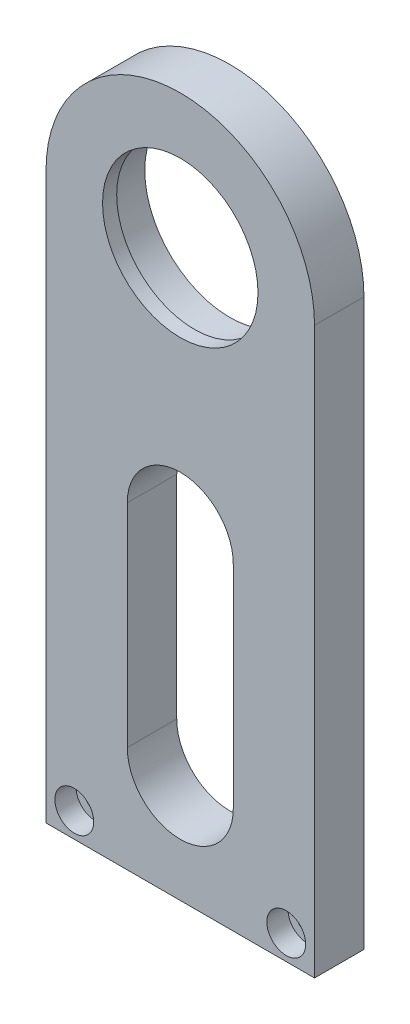
ISO-10303-21;
HEADER;
FILE_DESCRIPTION(('STEP AP214'),'2;1');
FILE_NAME('part.step','',(''),(''),'','','');
FILE_SCHEMA(('AUTOMOTIVE_DESIGN { 1 0 10303 214 1 1 1 1 }'));
ENDSEC;
DATA;
#1=APPLICATION_CONTEXT('core data for automotive mechanical design processes');
#2=APPLICATION_PROTOCOL_DEFINITION('international standard','automotive_design',2000,#1);
#3=PRODUCT_CONTEXT('',#1,'mechanical');
#4=PRODUCT('Part','Part','',(#3));
#5=PRODUCT_RELATED_PRODUCT_CATEGORY('part','',(#4));
#6=PRODUCT_DEFINITION_FORMATION('','',#4);
#7=PRODUCT_DEFINITION_CONTEXT('part definition',#1,'design');
#8=PRODUCT_DEFINITION('design','',#6,#7);
#9=PRODUCT_DEFINITION_SHAPE('','',#8);
#10=(LENGTH_UNIT() NAMED_UNIT(*) SI_UNIT(.MILLI.,.METRE.));
#11=(NAMED_UNIT(*) PLANE_ANGLE_UNIT() SI_UNIT($,.RADIAN.));
#12=(NAMED_UNIT(*) SI_UNIT($,.STERADIAN.) SOLID_ANGLE_UNIT());
#13=UNCERTAINTY_MEASURE_WITH_UNIT(LENGTH_MEASURE(1.E-05),#10,'distance_accuracy_value','');
#14=(GEOMETRIC_REPRESENTATION_CONTEXT(3) GLOBAL_UNCERTAINTY_ASSIGNED_CONTEXT((#13)) GLOBAL_UNIT_ASSIGNED_CONTEXT((#10,
#11,#12)) REPRESENTATION_CONTEXT('',''));
#15=CARTESIAN_POINT('',(0.,0.,0.));
#16=DIRECTION('',(0.,0.,1.));
#17=DIRECTION('',(1.,0.,0.));
#18=AXIS2_PLACEMENT_3D('',#15,#16,#17);
#19=CARTESIAN_POINT('',(0.,80.,7.));
#20=DIRECTION('',(0.,0.,-1.));
#21=DIRECTION('',(-1.,0.,0.));
#22=AXIS2_PLACEMENT_3D('',#19,#20,#21);
#23=CYLINDRICAL_SURFACE('',#22,11.);
#24=CARTESIAN_POINT('',(0.,80.,7.));
#25=DIRECTION('',(0.,0.,1.));
#26=DIRECTION('',(1.,0.,0.));
#27=AXIS2_PLACEMENT_3D('',#24,#25,#26);
#28=CIRCLE('',#27,11.);
#29=CARTESIAN_POINT('',(11.,80.,7.));
#30=VERTEX_POINT('',#29);
#31=EDGE_CURVE('E133',#30,#30,#28,.T.);
#32=ORIENTED_EDGE('',*,*,#31,.T.);
#33=EDGE_LOOP('',(#32));
#34=FACE_BOUND('',#33,.T.);
#35=CARTESIAN_POINT('',(0.,80.,5.));
#36=DIRECTION('',(0.,0.,-1.));
#37=DIRECTION('',(-1.,0.,0.));
#38=AXIS2_PLACEMENT_3D('',#35,#36,#37);
#39=CIRCLE('',#38,11.);
#40=CARTESIAN_POINT('',(-11.,80.,5.));
#41=VERTEX_POINT('',#40);
#42=EDGE_CURVE('E43',#41,#41,#39,.T.);
#43=ORIENTED_EDGE('',*,*,#42,.T.);
#44=EDGE_LOOP('',(#43));
#45=FACE_BOUND('',#44,.T.);
#46=ADVANCED_FACE('F39',(#34,#45),#23,.F.);
#47=CARTESIAN_POINT('',(15.,3.5,7.));
#48=DIRECTION('',(0.,0.,-1.));
#49=DIRECTION('',(-1.,0.,0.));
#50=AXIS2_PLACEMENT_3D('',#47,#48,#49);
#51=CYLINDRICAL_SURFACE('',#50,1.55);
#52=CARTESIAN_POINT('',(15.,3.5,0.));
#53=DIRECTION('',(0.,0.,1.));
#54=DIRECTION('',(1.,0.,0.));
#55=AXIS2_PLACEMENT_3D('',#52,#53,#54);
#56=CIRCLE('',#55,1.55);
#57=CARTESIAN_POINT('',(16.55,3.5,0.));
#58=VERTEX_POINT('',#57);
#59=EDGE_CURVE('E152',#58,#58,#56,.T.);
#60=ORIENTED_EDGE('',*,*,#59,.F.);
#61=EDGE_LOOP('',(#60));
#62=FACE_BOUND('',#61,.T.);
#63=CARTESIAN_POINT('',(15.,3.5,4.));
#64=DIRECTION('',(0.,0.,1.));
#65=DIRECTION('',(1.,0.,0.));
#66=AXIS2_PLACEMENT_3D('',#63,#64,#65);
#67=CIRCLE('',#66,1.55);
#68=CARTESIAN_POINT('',(16.55,3.5,4.));
#69=VERTEX_POINT('',#68);
#70=EDGE_CURVE('E177',#69,#69,#67,.T.);
#71=ORIENTED_EDGE('',*,*,#70,.T.);
#72=EDGE_LOOP('',(#71));
#73=FACE_BOUND('',#72,.T.);
#74=ADVANCED_FACE('F204',(#62,#73),#51,.F.);
#75=CARTESIAN_POINT('',(0.,15.,7.));
#76=DIRECTION('',(0.,0.,-1.));
#77=DIRECTION('',(-1.,0.,0.));
#78=AXIS2_PLACEMENT_3D('',#75,#76,#77);
#79=CYLINDRICAL_SURFACE('',#78,7.49999999999999);
#80=CARTESIAN_POINT('',(0.,15.,0.));
#81=DIRECTION('',(0.,0.,1.));
#82=DIRECTION('',(1.,0.,0.));
#83=AXIS2_PLACEMENT_3D('',#80,#81,#82);
#84=CIRCLE('',#83,7.49999999999999);
#85=CARTESIAN_POINT('',(-7.49999999999998,15.,0.));
#86=VERTEX_POINT('',#85);
#87=CARTESIAN_POINT('',(7.49999999999999,15.,0.));
#88=VERTEX_POINT('',#87);
#89=EDGE_CURVE('E155',#86,#88,#84,.T.);
#90=ORIENTED_EDGE('',*,*,#89,.F.);
#91=DIRECTION('',(0.,0.,-1.));
#92=VECTOR('',#91,1.);
#93=CARTESIAN_POINT('',(-7.49999999999998,15.,7.));
#94=LINE('',#93,#92);
#95=CARTESIAN_POINT('',(-7.49999999999998,15.,7.));
#96=VERTEX_POINT('',#95);
#97=EDGE_CURVE('E11',#96,#86,#94,.T.);
#98=ORIENTED_EDGE('',*,*,#97,.F.);
#99=CARTESIAN_POINT('',(0.,15.,7.));
#100=DIRECTION('',(0.,0.,1.));
#101=DIRECTION('',(1.,0.,0.));
#102=AXIS2_PLACEMENT_3D('',#99,#100,#101);
#103=CIRCLE('',#102,7.49999999999999);
#104=CARTESIAN_POINT('',(7.49999999999999,15.,7.));
#105=VERTEX_POINT('',#104);
#106=EDGE_CURVE('E129',#96,#105,#103,.T.);
#107=ORIENTED_EDGE('',*,*,#106,.T.);
#108=DIRECTION('',(0.,0.,-1.));
#109=VECTOR('',#108,1.);
#110=CARTESIAN_POINT('',(7.49999999999999,15.,7.));
#111=LINE('',#110,#109);
#112=EDGE_CURVE('E92',#105,#88,#111,.T.);
#113=ORIENTED_EDGE('',*,*,#112,.T.);
#114=EDGE_LOOP('',(#90,#98,#107,#113));
#115=FACE_BOUND('',#114,.T.);
#116=ADVANCED_FACE('F210',(#115),#79,.F.);
#117=CARTESIAN_POINT('',(-7.49999999999997,0.,7.));
#118=DIRECTION('',(1.,0.,0.));
#119=DIRECTION('',(0.,1.,0.));
#120=AXIS2_PLACEMENT_3D('',#117,#118,#119);
#121=PLANE('',#120);
#122=DIRECTION('',(0.,-1.,0.));
#123=VECTOR('',#122,1.);
#124=CARTESIAN_POINT('',(-7.49999999999997,0.,0.));
#125=LINE('',#124,#123);
#126=CARTESIAN_POINT('',(-7.5,45.,0.));
#127=VERTEX_POINT('',#126);
#128=EDGE_CURVE('E120',#127,#86,#125,.T.);
#129=ORIENTED_EDGE('',*,*,#128,.F.);
#130=DIRECTION('',(0.,0.,-1.));
#131=VECTOR('',#130,1.);
#132=CARTESIAN_POINT('',(-7.5,45.,7.));
#133=LINE('',#132,#131);
#134=CARTESIAN_POINT('',(-7.5,45.,7.));
#135=VERTEX_POINT('',#134);
#136=EDGE_CURVE('E49',#135,#127,#133,.T.);
#137=ORIENTED_EDGE('',*,*,#136,.F.);
#138=DIRECTION('',(0.,-1.,0.));
#139=VECTOR('',#138,1.);
#140=CARTESIAN_POINT('',(-7.49999999999997,0.,7.));
#141=LINE('',#140,#139);
#142=EDGE_CURVE('E118',#135,#96,#141,.T.);
#143=ORIENTED_EDGE('',*,*,#142,.T.);
#144=ORIENTED_EDGE('',*,*,#97,.T.);
#145=EDGE_LOOP('',(#129,#137,#143,#144));
#146=FACE_BOUND('',#145,.T.);
#147=ADVANCED_FACE('F117',(#146),#121,.T.);
#148=CARTESIAN_POINT('',(0.,45.,7.));
#149=DIRECTION('',(0.,0.,-1.));
#150=DIRECTION('',(-1.,0.,0.));
#151=AXIS2_PLACEMENT_3D('',#148,#149,#150);
#152=CYLINDRICAL_SURFACE('',#151,7.5);
#153=CARTESIAN_POINT('',(0.,45.,0.));
#154=DIRECTION('',(0.,0.,1.));
#155=DIRECTION('',(1.,0.,0.));
#156=AXIS2_PLACEMENT_3D('',#153,#154,#155);
#157=CIRCLE('',#156,7.5);
#158=CARTESIAN_POINT('',(7.5,45.,0.));
#159=VERTEX_POINT('',#158);
#160=EDGE_CURVE('E159',#159,#127,#157,.T.);
#161=ORIENTED_EDGE('',*,*,#160,.F.);
#162=DIRECTION('',(0.,0.,-1.));
#163=VECTOR('',#162,1.);
#164=CARTESIAN_POINT('',(7.5,45.,7.));
#165=LINE('',#164,#163);
#166=CARTESIAN_POINT('',(7.5,45.,7.));
#167=VERTEX_POINT('',#166);
#168=EDGE_CURVE('E85',#167,#159,#165,.T.);
#169=ORIENTED_EDGE('',*,*,#168,.F.);
#170=CARTESIAN_POINT('',(0.,45.,7.));
#171=DIRECTION('',(0.,0.,1.));
#172=DIRECTION('',(1.,0.,0.));
#173=AXIS2_PLACEMENT_3D('',#170,#171,#172);
#174=CIRCLE('',#173,7.5);
#175=EDGE_CURVE('E128',#167,#135,#174,.T.);
#176=ORIENTED_EDGE('',*,*,#175,.T.);
#177=ORIENTED_EDGE('',*,*,#136,.T.);
#178=EDGE_LOOP('',(#161,#169,#176,#177));
#179=FACE_BOUND('',#178,.T.);
#180=ADVANCED_FACE('F131',(#179),#152,.F.);
#181=CARTESIAN_POINT('',(19.,0.,7.));
#182=DIRECTION('',(-1.,0.,0.));
#183=DIRECTION('',(0.,0.,1.));
#184=AXIS2_PLACEMENT_3D('',#181,#182,#183);
#185=PLANE('',#184);
#186=DIRECTION('',(0.,1.,0.));
#187=VECTOR('',#186,1.);
#188=CARTESIAN_POINT('',(19.,0.,0.));
#189=LINE('',#188,#187);
#190=CARTESIAN_POINT('',(19.,0.,0.));
#191=VERTEX_POINT('',#190);
#192=CARTESIAN_POINT('',(19.,80.,0.));
#193=VERTEX_POINT('',#192);
#194=EDGE_CURVE('E140',#191,#193,#189,.T.);
#195=ORIENTED_EDGE('',*,*,#194,.T.);
#196=DIRECTION('',(0.,0.,-1.));
#197=VECTOR('',#196,1.);
#198=CARTESIAN_POINT('',(19.,80.,7.));
#199=LINE('',#198,#197);
#200=CARTESIAN_POINT('',(19.,80.,7.));
#201=VERTEX_POINT('',#200);
#202=EDGE_CURVE('E168',#201,#193,#199,.T.);
#203=ORIENTED_EDGE('',*,*,#202,.F.);
#204=DIRECTION('',(0.,1.,0.));
#205=VECTOR('',#204,1.);
#206=CARTESIAN_POINT('',(19.,0.,7.));
#207=LINE('',#206,#205);
#208=CARTESIAN_POINT('',(19.,0.,7.));
#209=VERTEX_POINT('',#208);
#210=EDGE_CURVE('E166',#209,#201,#207,.T.);
#211=ORIENTED_EDGE('',*,*,#210,.F.);
#212=DIRECTION('',(0.,0.,-1.));
#213=VECTOR('',#212,1.);
#214=CARTESIAN_POINT('',(19.,0.,7.));
#215=LINE('',#214,#213);
#216=EDGE_CURVE('E139',#209,#191,#215,.T.);
#217=ORIENTED_EDGE('',*,*,#216,.T.);
#218=EDGE_LOOP('',(#195,#203,#211,#217));
#219=FACE_BOUND('',#218,.T.);
#220=ADVANCED_FACE('F41',(#219),#185,.F.);
#221=CARTESIAN_POINT('',(0.,80.,7.));
#222=DIRECTION('',(0.,0.,-1.));
#223=DIRECTION('',(-1.,0.,0.));
#224=AXIS2_PLACEMENT_3D('',#221,#222,#223);
#225=CYLINDRICAL_SURFACE('',#224,19.);
#226=CARTESIAN_POINT('',(0.,80.,0.));
#227=DIRECTION('',(0.,0.,1.));
#228=DIRECTION('',(1.,0.,0.));
#229=AXIS2_PLACEMENT_3D('',#226,#227,#228);
#230=CIRCLE('',#229,19.);
#231=CARTESIAN_POINT('',(-19.,80.,0.));
#232=VERTEX_POINT('',#231);
#233=EDGE_CURVE('E143',#193,#232,#230,.T.);
#234=ORIENTED_EDGE('',*,*,#233,.T.);
#235=DIRECTION('',(0.,0.,-1.));
#236=VECTOR('',#235,1.);
#237=CARTESIAN_POINT('',(-19.,80.,7.));
#238=LINE('',#237,#236);
#239=CARTESIAN_POINT('',(-19.,80.,7.));
#240=VERTEX_POINT('',#239);
#241=EDGE_CURVE('E174',#240,#232,#238,.T.);
#242=ORIENTED_EDGE('',*,*,#241,.F.);
#243=CARTESIAN_POINT('',(0.,80.,7.));
#244=DIRECTION('',(0.,0.,1.));
#245=DIRECTION('',(1.,0.,0.));
#246=AXIS2_PLACEMENT_3D('',#243,#244,#245);
#247=CIRCLE('',#246,19.);
#248=EDGE_CURVE('E100',#201,#240,#247,.T.);
#249=ORIENTED_EDGE('',*,*,#248,.F.);
#250=ORIENTED_EDGE('',*,*,#202,.T.);
#251=EDGE_LOOP('',(#234,#242,#249,#250));
#252=FACE_BOUND('',#251,.T.);
#253=ADVANCED_FACE('F233',(#252),#225,.T.);
#254=CARTESIAN_POINT('',(-19.,0.,7.));
#255=DIRECTION('',(-1.,0.,0.));
#256=DIRECTION('',(0.,0.,1.));
#257=AXIS2_PLACEMENT_3D('',#254,#255,#256);
#258=PLANE('',#257);
#259=DIRECTION('',(0.,1.,0.));
#260=VECTOR('',#259,1.);
#261=CARTESIAN_POINT('',(-19.,0.,0.));
#262=LINE('',#261,#260);
#263=CARTESIAN_POINT('',(-19.,0.,0.));
#264=VERTEX_POINT('',#263);
#265=EDGE_CURVE('E147',#264,#232,#262,.T.);
#266=ORIENTED_EDGE('',*,*,#265,.F.);
#267=DIRECTION('',(0.,0.,-1.));
#268=VECTOR('',#267,1.);
#269=CARTESIAN_POINT('',(-19.,0.,7.));
#270=LINE('',#269,#268);
#271=CARTESIAN_POINT('',(-19.,0.,7.));
#272=VERTEX_POINT('',#271);
#273=EDGE_CURVE('E172',#272,#264,#270,.T.);
#274=ORIENTED_EDGE('',*,*,#273,.F.);
#275=DIRECTION('',(0.,1.,0.));
#276=VECTOR('',#275,1.);
#277=CARTESIAN_POINT('',(-19.,0.,7.));
#278=LINE('',#277,#276);
#279=EDGE_CURVE('E249',#272,#240,#278,.T.);
#280=ORIENTED_EDGE('',*,*,#279,.T.);
#281=ORIENTED_EDGE('',*,*,#241,.T.);
#282=EDGE_LOOP('',(#266,#274,#280,#281));
#283=FACE_BOUND('',#282,.T.);
#284=ADVANCED_FACE('F219',(#283),#258,.T.);
#285=CARTESIAN_POINT('',(-15.,3.5,7.));
#286=DIRECTION('',(0.,0.,-1.));
#287=DIRECTION('',(-1.,0.,0.));
#288=AXIS2_PLACEMENT_3D('',#285,#286,#287);
#289=CYLINDRICAL_SURFACE('',#288,1.55);
#290=CARTESIAN_POINT('',(-15.,3.5,4.));
#291=DIRECTION('',(0.,0.,-1.));
#292=DIRECTION('',(-1.,0.,0.));
#293=AXIS2_PLACEMENT_3D('',#290,#291,#292);
#294=CIRCLE('',#293,1.55);
#295=CARTESIAN_POINT('',(-16.55,3.5,4.));
#296=VERTEX_POINT('',#295);
#297=EDGE_CURVE('E144',#296,#296,#294,.F.);
#298=ORIENTED_EDGE('',*,*,#297,.T.);
#299=EDGE_LOOP('',(#298));
#300=FACE_BOUND('',#299,.T.);
#301=CARTESIAN_POINT('',(-15.,3.5,0.));
#302=DIRECTION('',(0.,0.,1.));
#303=DIRECTION('',(1.,0.,0.));
#304=AXIS2_PLACEMENT_3D('',#301,#302,#303);
#305=CIRCLE('',#304,1.55);
#306=CARTESIAN_POINT('',(-13.45,3.5,0.));
#307=VERTEX_POINT('',#306);
#308=EDGE_CURVE('E163',#307,#307,#305,.F.);
#309=ORIENTED_EDGE('',*,*,#308,.T.);
#310=EDGE_LOOP('',(#309));
#311=FACE_BOUND('',#310,.T.);
#312=ADVANCED_FACE('F183',(#300,#311),#289,.F.);
#313=CARTESIAN_POINT('',(7.49999999999999,0.,7.));
#314=DIRECTION('',(1.,0.,0.));
#315=DIRECTION('',(0.,1.,0.));
#316=AXIS2_PLACEMENT_3D('',#313,#314,#315);
#317=PLANE('',#316);
#318=DIRECTION('',(0.,-1.,0.));
#319=VECTOR('',#318,1.);
#320=CARTESIAN_POINT('',(7.49999999999999,0.,0.));
#321=LINE('',#320,#319);
#322=EDGE_CURVE('E161',#159,#88,#321,.T.);
#323=ORIENTED_EDGE('',*,*,#322,.T.);
#324=ORIENTED_EDGE('',*,*,#112,.F.);
#325=DIRECTION('',(0.,-1.,0.));
#326=VECTOR('',#325,1.);
#327=CARTESIAN_POINT('',(7.49999999999999,0.,7.));
#328=LINE('',#327,#326);
#329=EDGE_CURVE('E58',#167,#105,#328,.T.);
#330=ORIENTED_EDGE('',*,*,#329,.F.);
#331=ORIENTED_EDGE('',*,*,#168,.T.);
#332=EDGE_LOOP('',(#323,#324,#330,#331));
#333=FACE_BOUND('',#332,.T.);
#334=ADVANCED_FACE('F218',(#333),#317,.F.);
#335=CARTESIAN_POINT('',(0.,0.,7.));
#336=DIRECTION('',(0.,1.,0.));
#337=DIRECTION('',(0.,0.,1.));
#338=AXIS2_PLACEMENT_3D('',#335,#336,#337);
#339=PLANE('',#338);
#340=DIRECTION('',(1.,0.,0.));
#341=VECTOR('',#340,1.);
#342=CARTESIAN_POINT('',(0.,0.,0.));
#343=LINE('',#342,#341);
#344=EDGE_CURVE('E150',#264,#191,#343,.T.);
#345=ORIENTED_EDGE('',*,*,#344,.T.);
#346=ORIENTED_EDGE('',*,*,#216,.F.);
#347=DIRECTION('',(1.,0.,0.));
#348=VECTOR('',#347,1.);
#349=CARTESIAN_POINT('',(0.,0.,7.));
#350=LINE('',#349,#348);
#351=EDGE_CURVE('E251',#272,#209,#350,.T.);
#352=ORIENTED_EDGE('',*,*,#351,.F.);
#353=ORIENTED_EDGE('',*,*,#273,.T.);
#354=EDGE_LOOP('',(#345,#346,#352,#353));
#355=FACE_BOUND('',#354,.T.);
#356=ADVANCED_FACE('F222',(#355),#339,.F.);
#357=CARTESIAN_POINT('',(0.,0.,7.));
#358=DIRECTION('',(0.,0.,1.));
#359=DIRECTION('',(1.,0.,0.));
#360=AXIS2_PLACEMENT_3D('',#357,#358,#359);
#361=PLANE('',#360);
#362=CARTESIAN_POINT('',(15.,3.5,7.));
#363=DIRECTION('',(0.,0.,1.));
#364=DIRECTION('',(1.,0.,0.));
#365=AXIS2_PLACEMENT_3D('',#362,#363,#364);
#366=CIRCLE('',#365,2.75);
#367=CARTESIAN_POINT('',(17.75,3.5,7.));
#368=VERTEX_POINT('',#367);
#369=EDGE_CURVE('E265',#368,#368,#366,.T.);
#370=ORIENTED_EDGE('',*,*,#369,.F.);
#371=EDGE_LOOP('',(#370));
#372=FACE_BOUND('',#371,.T.);
#373=CARTESIAN_POINT('',(-15.,3.5,7.));
#374=DIRECTION('',(0.,0.,1.));
#375=DIRECTION('',(-1.,0.,0.));
#376=AXIS2_PLACEMENT_3D('',#373,#374,#375);
#377=CIRCLE('',#376,2.75);
#378=CARTESIAN_POINT('',(-17.75,3.5,7.));
#379=VERTEX_POINT('',#378);
#380=EDGE_CURVE('E260',#379,#379,#377,.T.);
#381=ORIENTED_EDGE('',*,*,#380,.F.);
#382=EDGE_LOOP('',(#381));
#383=FACE_BOUND('',#382,.T.);
#384=ORIENTED_EDGE('',*,*,#210,.T.);
#385=ORIENTED_EDGE('',*,*,#248,.T.);
#386=ORIENTED_EDGE('',*,*,#279,.F.);
#387=ORIENTED_EDGE('',*,*,#351,.T.);
#388=EDGE_LOOP('',(#384,#385,#386,#387));
#389=FACE_BOUND('',#388,.T.);
#390=ORIENTED_EDGE('',*,*,#106,.F.);
#391=ORIENTED_EDGE('',*,*,#142,.F.);
#392=ORIENTED_EDGE('',*,*,#175,.F.);
#393=ORIENTED_EDGE('',*,*,#329,.T.);
#394=EDGE_LOOP('',(#390,#391,#392,#393));
#395=FACE_BOUND('',#394,.T.);
#396=ORIENTED_EDGE('',*,*,#31,.F.);
#397=EDGE_LOOP('',(#396));
#398=FACE_BOUND('',#397,.T.);
#399=ADVANCED_FACE('F126',(#372,#383,#389,#395,#398),#361,.T.);
#400=CARTESIAN_POINT('',(0.,0.,0.));
#401=DIRECTION('',(0.,0.,1.));
#402=DIRECTION('',(1.,0.,0.));
#403=AXIS2_PLACEMENT_3D('',#400,#401,#402);
#404=PLANE('',#403);
#405=CARTESIAN_POINT('',(0.,80.,0.));
#406=DIRECTION('',(0.,0.,-1.));
#407=DIRECTION('',(-1.,0.,0.));
#408=AXIS2_PLACEMENT_3D('',#405,#406,#407);
#409=CIRCLE('',#408,12.025);
#410=CARTESIAN_POINT('',(-12.025,80.,0.));
#411=VERTEX_POINT('',#410);
#412=EDGE_CURVE('E270',#411,#411,#409,.T.);
#413=ORIENTED_EDGE('',*,*,#412,.F.);
#414=EDGE_LOOP('',(#413));
#415=FACE_BOUND('',#414,.T.);
#416=ORIENTED_EDGE('',*,*,#194,.F.);
#417=ORIENTED_EDGE('',*,*,#344,.F.);
#418=ORIENTED_EDGE('',*,*,#265,.T.);
#419=ORIENTED_EDGE('',*,*,#233,.F.);
#420=EDGE_LOOP('',(#416,#417,#418,#419));
#421=FACE_BOUND('',#420,.T.);
#422=ORIENTED_EDGE('',*,*,#59,.T.);
#423=EDGE_LOOP('',(#422));
#424=FACE_BOUND('',#423,.T.);
#425=ORIENTED_EDGE('',*,*,#89,.T.);
#426=ORIENTED_EDGE('',*,*,#322,.F.);
#427=ORIENTED_EDGE('',*,*,#160,.T.);
#428=ORIENTED_EDGE('',*,*,#128,.T.);
#429=EDGE_LOOP('',(#425,#426,#427,#428));
#430=FACE_BOUND('',#429,.T.);
#431=ORIENTED_EDGE('',*,*,#308,.F.);
#432=EDGE_LOOP('',(#431));
#433=FACE_BOUND('',#432,.T.);
#434=ADVANCED_FACE('F189',(#415,#421,#424,#430,#433),#404,.F.);
#435=CARTESIAN_POINT('',(-15.,3.5,4.));
#436=DIRECTION('',(0.,0.,-1.));
#437=DIRECTION('',(-1.,0.,0.));
#438=AXIS2_PLACEMENT_3D('',#435,#436,#437);
#439=PLANE('',#438);
#440=CARTESIAN_POINT('',(-15.,3.5,4.));
#441=DIRECTION('',(0.,0.,1.));
#442=DIRECTION('',(-1.,0.,0.));
#443=AXIS2_PLACEMENT_3D('',#440,#441,#442);
#444=CIRCLE('',#443,2.75);
#445=CARTESIAN_POINT('',(-17.75,3.5,4.));
#446=VERTEX_POINT('',#445);
#447=EDGE_CURVE('E263',#446,#446,#444,.T.);
#448=ORIENTED_EDGE('',*,*,#447,.T.);
#449=EDGE_LOOP('',(#448));
#450=FACE_BOUND('',#449,.T.);
#451=ORIENTED_EDGE('',*,*,#297,.F.);
#452=EDGE_LOOP('',(#451));
#453=FACE_BOUND('',#452,.T.);
#454=ADVANCED_FACE('F186',(#450,#453),#439,.F.);
#455=CARTESIAN_POINT('',(-15.,3.5,4.));
#456=DIRECTION('',(0.,0.,1.));
#457=DIRECTION('',(1.,0.,0.));
#458=AXIS2_PLACEMENT_3D('',#455,#456,#457);
#459=CYLINDRICAL_SURFACE('',#458,2.75);
#460=ORIENTED_EDGE('',*,*,#447,.F.);
#461=EDGE_LOOP('',(#460));
#462=FACE_BOUND('',#461,.T.);
#463=ORIENTED_EDGE('',*,*,#380,.T.);
#464=EDGE_LOOP('',(#463));
#465=FACE_BOUND('',#464,.T.);
#466=ADVANCED_FACE('F188',(#462,#465),#459,.F.);
#467=CARTESIAN_POINT('',(15.,3.5,4.));
#468=DIRECTION('',(0.,0.,1.));
#469=DIRECTION('',(1.,0.,0.));
#470=AXIS2_PLACEMENT_3D('',#467,#468,#469);
#471=CYLINDRICAL_SURFACE('',#470,2.75);
#472=CARTESIAN_POINT('',(15.,3.5,4.));
#473=DIRECTION('',(0.,0.,1.));
#474=DIRECTION('',(1.,0.,0.));
#475=AXIS2_PLACEMENT_3D('',#472,#473,#474);
#476=CIRCLE('',#475,2.75);
#477=CARTESIAN_POINT('',(17.75,3.5,4.));
#478=VERTEX_POINT('',#477);
#479=EDGE_CURVE('E179',#478,#478,#476,.T.);
#480=ORIENTED_EDGE('',*,*,#479,.F.);
#481=EDGE_LOOP('',(#480));
#482=FACE_BOUND('',#481,.T.);
#483=ORIENTED_EDGE('',*,*,#369,.T.);
#484=EDGE_LOOP('',(#483));
#485=FACE_BOUND('',#484,.T.);
#486=ADVANCED_FACE('F196',(#482,#485),#471,.F.);
#487=CARTESIAN_POINT('',(15.,3.5,4.));
#488=DIRECTION('',(0.,0.,1.));
#489=DIRECTION('',(1.,0.,0.));
#490=AXIS2_PLACEMENT_3D('',#487,#488,#489);
#491=PLANE('',#490);
#492=ORIENTED_EDGE('',*,*,#70,.F.);
#493=EDGE_LOOP('',(#492));
#494=FACE_BOUND('',#493,.T.);
#495=ORIENTED_EDGE('',*,*,#479,.T.);
#496=EDGE_LOOP('',(#495));
#497=FACE_BOUND('',#496,.T.);
#498=ADVANCED_FACE('F287',(#494,#497),#491,.T.);
#499=CARTESIAN_POINT('',(0.,80.,5.));
#500=DIRECTION('',(0.,0.,-1.));
#501=DIRECTION('',(-1.,0.,0.));
#502=AXIS2_PLACEMENT_3D('',#499,#500,#501);
#503=CYLINDRICAL_SURFACE('',#502,12.025);
#504=CARTESIAN_POINT('',(0.,80.,5.));
#505=DIRECTION('',(0.,0.,-1.));
#506=DIRECTION('',(-1.,0.,0.));
#507=AXIS2_PLACEMENT_3D('',#504,#505,#506);
#508=CIRCLE('',#507,12.025);
#509=CARTESIAN_POINT('',(-12.025,80.,5.));
#510=VERTEX_POINT('',#509);
#511=EDGE_CURVE('E273',#510,#510,#508,.T.);
#512=ORIENTED_EDGE('',*,*,#511,.F.);
#513=EDGE_LOOP('',(#512));
#514=FACE_BOUND('',#513,.T.);
#515=ORIENTED_EDGE('',*,*,#412,.T.);
#516=EDGE_LOOP('',(#515));
#517=FACE_BOUND('',#516,.T.);
#518=ADVANCED_FACE('F282',(#514,#517),#503,.F.);
#519=CARTESIAN_POINT('',(0.,80.,5.));
#520=DIRECTION('',(0.,0.,-1.));
#521=DIRECTION('',(-1.,0.,0.));
#522=AXIS2_PLACEMENT_3D('',#519,#520,#521);
#523=PLANE('',#522);
#524=ORIENTED_EDGE('',*,*,#42,.F.);
#525=EDGE_LOOP('',(#524));
#526=FACE_BOUND('',#525,.T.);
#527=ORIENTED_EDGE('',*,*,#511,.T.);
#528=EDGE_LOOP('',(#527));
#529=FACE_BOUND('',#528,.T.);
#530=ADVANCED_FACE('F280',(#526,#529),#523,.T.);
#531=CLOSED_SHELL('',(#46,#74,#116,#147,#180,#220,#253,#284,#312,#334,#356,#399,#434,#454,#466,
#486,#498,#518,#530));
#532=MANIFOLD_SOLID_BREP('B2',#531);
#533=ADVANCED_BREP_SHAPE_REPRESENTATION('',(#18,#532),#14);
#534=SHAPE_DEFINITION_REPRESENTATION(#9,#533);
ENDSEC;
END-ISO-10303-21;
